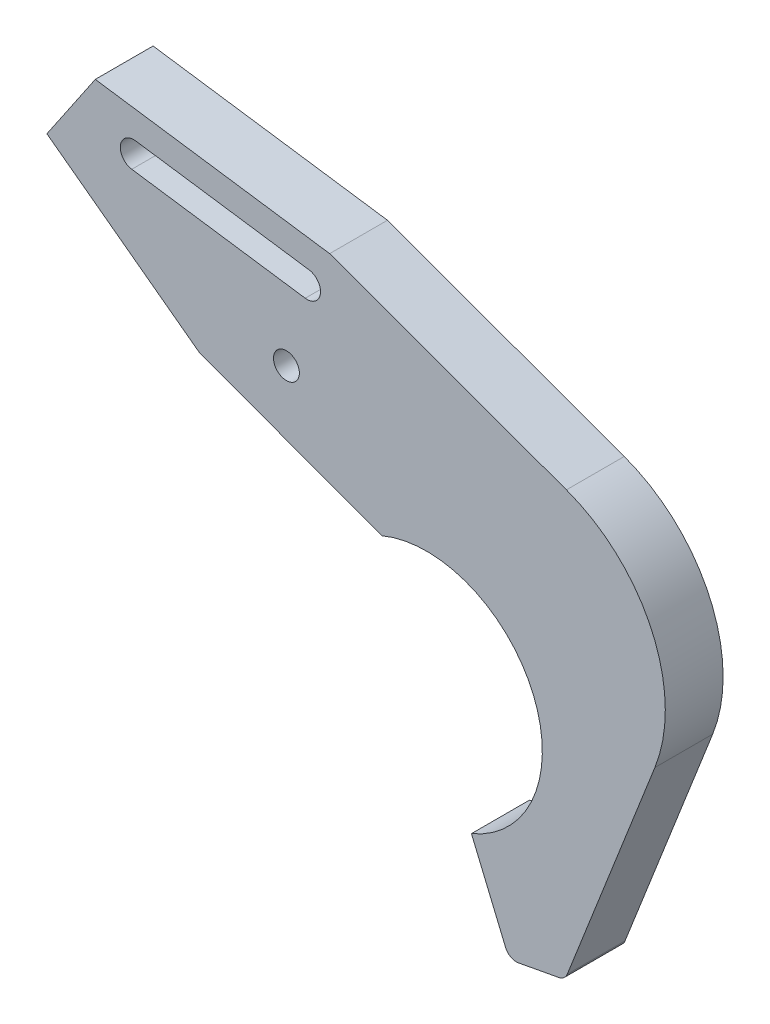
ISO-10303-21;
HEADER;
FILE_DESCRIPTION(('STEP AP214'),'2;1');
FILE_NAME('part.step','',(''),(''),'','','');
FILE_SCHEMA(('AUTOMOTIVE_DESIGN { 1 0 10303 214 1 1 1 1 }'));
ENDSEC;
DATA;
#1=APPLICATION_CONTEXT('core data for automotive mechanical design processes');
#2=APPLICATION_PROTOCOL_DEFINITION('international standard','automotive_design',2000,#1);
#3=PRODUCT_CONTEXT('',#1,'mechanical');
#4=PRODUCT('Part','Part','',(#3));
#5=PRODUCT_RELATED_PRODUCT_CATEGORY('part','',(#4));
#6=PRODUCT_DEFINITION_FORMATION('','',#4);
#7=PRODUCT_DEFINITION_CONTEXT('part definition',#1,'design');
#8=PRODUCT_DEFINITION('design','',#6,#7);
#9=PRODUCT_DEFINITION_SHAPE('','',#8);
#10=(LENGTH_UNIT() NAMED_UNIT(*) SI_UNIT(.MILLI.,.METRE.));
#11=(NAMED_UNIT(*) PLANE_ANGLE_UNIT() SI_UNIT($,.RADIAN.));
#12=(NAMED_UNIT(*) SI_UNIT($,.STERADIAN.) SOLID_ANGLE_UNIT());
#13=UNCERTAINTY_MEASURE_WITH_UNIT(LENGTH_MEASURE(1.E-05),#10,'distance_accuracy_value','');
#14=(GEOMETRIC_REPRESENTATION_CONTEXT(3) GLOBAL_UNCERTAINTY_ASSIGNED_CONTEXT((#13)) GLOBAL_UNIT_ASSIGNED_CONTEXT((#10,
#11,#12)) REPRESENTATION_CONTEXT('',''));
#15=CARTESIAN_POINT('',(0.,0.,0.));
#16=DIRECTION('',(0.,0.,1.));
#17=DIRECTION('',(1.,0.,0.));
#18=AXIS2_PLACEMENT_3D('',#15,#16,#17);
#19=CARTESIAN_POINT('',(51.2000389622178,6.21803864779508,12.7));
#20=DIRECTION('',(0.,0.,1.));
#21=DIRECTION('',(1.,0.,0.));
#22=AXIS2_PLACEMENT_3D('',#19,#20,#21);
#23=PLANE('',#22);
#24=DIRECTION('',(0.386867201283231,-0.92213543938582,0.));
#25=VECTOR('',#24,1.);
#26=CARTESIAN_POINT('',(61.0264658748119,-17.2042015126048,12.7));
#27=LINE('',#26,#25);
#28=CARTESIAN_POINT('',(61.0264658748119,-17.2042015126048,12.7));
#29=VERTEX_POINT('',#28);
#30=CARTESIAN_POINT('',(68.5408768623582,-35.1155278146079,12.7));
#31=VERTEX_POINT('',#30);
#32=EDGE_CURVE('E232',#29,#31,#27,.T.);
#33=ORIENTED_EDGE('',*,*,#32,.T.);
#34=CARTESIAN_POINT('',(70.8831008783982,-34.1328851233485,12.7));
#35=DIRECTION('',(0.,0.,1.));
#36=DIRECTION('',(1.,0.,0.));
#37=AXIS2_PLACEMENT_3D('',#34,#35,#36);
#38=CIRCLE('',#37,2.53999999999999);
#39=CARTESIAN_POINT('',(71.347877302438,-36.6300000337315,12.7));
#40=VERTEX_POINT('',#39);
#41=EDGE_CURVE('E48',#31,#40,#38,.T.);
#42=ORIENTED_EDGE('',*,*,#41,.T.);
#43=DIRECTION('',(0.983116106449977,0.182982844110145,0.));
#44=VECTOR('',#43,1.);
#45=CARTESIAN_POINT('',(81.5667670797044,-34.7280054444612,12.7));
#46=LINE('',#45,#44);
#47=CARTESIAN_POINT('',(80.1828782284302,-34.9855822619674,12.7));
#48=VERTEX_POINT('',#47);
#49=EDGE_CURVE('E235',#40,#48,#46,.T.);
#50=ORIENTED_EDGE('',*,*,#49,.T.);
#51=CARTESIAN_POINT('',(79.7181018043904,-32.4884673515845,12.7));
#52=DIRECTION('',(0.,0.,1.));
#53=DIRECTION('',(1.,0.,0.));
#54=AXIS2_PLACEMENT_3D('',#51,#52,#53);
#55=CIRCLE('',#54,2.53999999999999);
#56=CARTESIAN_POINT('',(82.0819073101514,-33.4179960122154,12.7));
#57=VERTEX_POINT('',#56);
#58=EDGE_CURVE('E55',#48,#57,#55,.T.);
#59=ORIENTED_EDGE('',*,*,#58,.T.);
#60=DIRECTION('',(0.365956165602747,0.930632088882247,0.));
#61=VECTOR('',#60,1.);
#62=CARTESIAN_POINT('',(95.2803043935317,0.145728286221098,12.7));
#63=LINE('',#62,#61);
#64=CARTESIAN_POINT('',(101.324672793619,15.5166489561378,12.7));
#65=VERTEX_POINT('',#64);
#66=EDGE_CURVE('E238',#57,#65,#63,.T.);
#67=ORIENTED_EDGE('',*,*,#66,.T.);
#68=CARTESIAN_POINT('',(70.5952012187268,27.6005215443405,12.7));
#69=DIRECTION('',(0.,0.,1.));
#70=DIRECTION('',(1.,0.,0.));
#71=AXIS2_PLACEMENT_3D('',#68,#69,#70);
#72=CIRCLE('',#71,33.02);
#73=CARTESIAN_POINT('',(81.8915348264187,58.6281422559537,12.7));
#74=VERTEX_POINT('',#73);
#75=EDGE_CURVE('E311',#65,#74,#72,.T.);
#76=ORIENTED_EDGE('',*,*,#75,.T.);
#77=DIRECTION('',(-0.93966143887381,0.342105802776861,0.));
#78=VECTOR('',#77,1.);
#79=CARTESIAN_POINT('',(113.41396547303,47.1516614771304,12.7));
#80=LINE('',#79,#78);
#81=CARTESIAN_POINT('',(29.8798289099471,77.56422462587,12.7));
#82=VERTEX_POINT('',#81);
#83=EDGE_CURVE('E241',#74,#82,#80,.T.);
#84=ORIENTED_EDGE('',*,*,#83,.T.);
#85=DIRECTION('',(-0.989812837536592,0.142374669965415,0.));
#86=VECTOR('',#85,1.);
#87=CARTESIAN_POINT('',(-21.6036385590415,84.9696061400307,12.7));
#88=LINE('',#87,#86);
#89=CARTESIAN_POINT('',(-21.6036385590415,84.9696061400307,12.7));
#90=VERTEX_POINT('',#89);
#91=EDGE_CURVE('E244',#82,#90,#88,.T.);
#92=ORIENTED_EDGE('',*,*,#91,.T.);
#93=DIRECTION('',(-0.561500064424069,-0.827476693116952,0.));
#94=VECTOR('',#93,1.);
#95=CARTESIAN_POINT('',(-32.2312755205968,69.3077702013021,12.7));
#96=LINE('',#95,#94);
#97=CARTESIAN_POINT('',(-32.2312755205968,69.3077702013021,12.7));
#98=VERTEX_POINT('',#97);
#99=EDGE_CURVE('E218',#90,#98,#96,.T.);
#100=ORIENTED_EDGE('',*,*,#99,.T.);
#101=DIRECTION('',(0.802882803656803,-0.596136900042424,0.));
#102=VECTOR('',#101,1.);
#103=CARTESIAN_POINT('',(1.32132678465555,44.3951126683362,12.7));
#104=LINE('',#103,#102);
#105=CARTESIAN_POINT('',(1.32132678465555,44.3951126683362,12.7));
#106=VERTEX_POINT('',#105);
#107=EDGE_CURVE('E222',#98,#106,#104,.T.);
#108=ORIENTED_EDGE('',*,*,#107,.T.);
#109=DIRECTION('',(0.938352777700583,-0.345679135299775,0.));
#110=VECTOR('',#109,1.);
#111=CARTESIAN_POINT('',(41.3736120496238,29.6402788081949,12.7));
#112=LINE('',#111,#110);
#113=CARTESIAN_POINT('',(41.3736120496238,29.6402788081949,12.7));
#114=VERTEX_POINT('',#113);
#115=EDGE_CURVE('E226',#106,#114,#112,.T.);
#116=ORIENTED_EDGE('',*,*,#115,.T.);
#117=CARTESIAN_POINT('',(51.2000389622178,6.21803864779508,12.7));
#118=DIRECTION('',(0.,0.,-1.));
#119=DIRECTION('',(1.,0.,0.));
#120=AXIS2_PLACEMENT_3D('',#117,#118,#119);
#121=CIRCLE('',#120,25.4);
#122=EDGE_CURVE('E229',#114,#29,#121,.T.);
#123=ORIENTED_EDGE('',*,*,#122,.T.);
#124=EDGE_LOOP('',(#33,#42,#50,#59,#67,#76,#84,#92,#100,#108,#116,#123));
#125=FACE_BOUND('',#124,.T.);
#126=CARTESIAN_POINT('',(20.3901427657872,51.5029722152476,12.7));
#127=DIRECTION('',(0.,0.,1.));
#128=DIRECTION('',(1.,0.,0.));
#129=AXIS2_PLACEMENT_3D('',#126,#127,#128);
#130=CIRCLE('',#129,2.83838254770481);
#131=CARTESIAN_POINT('',(23.228525313492,51.5029722152476,12.7));
#132=VERTEX_POINT('',#131);
#133=EDGE_CURVE('E210',#132,#132,#130,.T.);
#134=ORIENTED_EDGE('',*,*,#133,.F.);
#135=EDGE_LOOP('',(#134));
#136=FACE_BOUND('',#135,.T.);
#137=DIRECTION('',(-0.989812837536592,0.142374669965415,0.));
#138=VECTOR('',#137,1.);
#139=CARTESIAN_POINT('',(25.3539797880549,72.2175001182984,12.7));
#140=LINE('',#139,#138);
#141=CARTESIAN_POINT('',(25.3539797880549,72.2175001182984,12.7));
#142=VERTEX_POINT('',#141);
#143=CARTESIAN_POINT('',(-12.7460202119451,77.6978037878109,12.7));
#144=VERTEX_POINT('',#143);
#145=EDGE_CURVE('E168',#142,#144,#140,.T.);
#146=ORIENTED_EDGE('',*,*,#145,.F.);
#147=CARTESIAN_POINT('',(24.9354687635728,69.3079405401544,12.7));
#148=DIRECTION('',(0.,0.,1.));
#149=DIRECTION('',(1.,0.,0.));
#150=AXIS2_PLACEMENT_3D('',#147,#148,#149);
#151=CIRCLE('',#150,2.93950479101209);
#152=CARTESIAN_POINT('',(24.5169577390907,66.3983809620103,12.7));
#153=VERTEX_POINT('',#152);
#154=EDGE_CURVE('E157',#153,#142,#151,.T.);
#155=ORIENTED_EDGE('',*,*,#154,.F.);
#156=DIRECTION('',(0.989812837536592,-0.142374669965415,0.));
#157=VECTOR('',#156,1.);
#158=CARTESIAN_POINT('',(24.5169577390907,66.3983809620103,12.7));
#159=LINE('',#158,#157);
#160=CARTESIAN_POINT('',(-13.5830422609093,71.8786846315227,12.7));
#161=VERTEX_POINT('',#160);
#162=EDGE_CURVE('E186',#161,#153,#159,.T.);
#163=ORIENTED_EDGE('',*,*,#162,.F.);
#164=CARTESIAN_POINT('',(-13.1645312364272,74.7882442096668,12.7));
#165=DIRECTION('',(0.,0.,1.));
#166=DIRECTION('',(1.,0.,0.));
#167=AXIS2_PLACEMENT_3D('',#164,#165,#166);
#168=CIRCLE('',#167,2.93950479101209);
#169=EDGE_CURVE('E182',#144,#161,#168,.T.);
#170=ORIENTED_EDGE('',*,*,#169,.F.);
#171=EDGE_LOOP('',(#146,#155,#163,#170));
#172=FACE_BOUND('',#171,.T.);
#173=ADVANCED_FACE('F39',(#125,#136,#172),#23,.T.);
#174=CARTESIAN_POINT('',(51.2000389622178,6.21803864779508,0.));
#175=DIRECTION('',(0.,0.,1.));
#176=DIRECTION('',(1.,0.,0.));
#177=AXIS2_PLACEMENT_3D('',#174,#175,#176);
#178=PLANE('',#177);
#179=CARTESIAN_POINT('',(20.3901427657872,51.5029722152476,0.));
#180=DIRECTION('',(0.,0.,1.));
#181=DIRECTION('',(1.,0.,0.));
#182=AXIS2_PLACEMENT_3D('',#179,#180,#181);
#183=CIRCLE('',#182,2.83838254770481);
#184=CARTESIAN_POINT('',(23.228525313492,51.5029722152476,0.));
#185=VERTEX_POINT('',#184);
#186=EDGE_CURVE('E177',#185,#185,#183,.T.);
#187=ORIENTED_EDGE('',*,*,#186,.T.);
#188=EDGE_LOOP('',(#187));
#189=FACE_BOUND('',#188,.T.);
#190=DIRECTION('',(0.983116106449977,0.182982844110145,0.));
#191=VECTOR('',#190,1.);
#192=CARTESIAN_POINT('',(81.5667670797044,-34.7280054444612,0.));
#193=LINE('',#192,#191);
#194=CARTESIAN_POINT('',(71.347877302438,-36.6300000337315,0.));
#195=VERTEX_POINT('',#194);
#196=CARTESIAN_POINT('',(80.1828782284302,-34.9855822619674,0.));
#197=VERTEX_POINT('',#196);
#198=EDGE_CURVE('E264',#195,#197,#193,.T.);
#199=ORIENTED_EDGE('',*,*,#198,.F.);
#200=CARTESIAN_POINT('',(70.8831008783982,-34.1328851233485,0.));
#201=DIRECTION('',(0.,0.,1.));
#202=DIRECTION('',(1.,0.,0.));
#203=AXIS2_PLACEMENT_3D('',#200,#201,#202);
#204=CIRCLE('',#203,2.53999999999999);
#205=CARTESIAN_POINT('',(68.5408768623582,-35.1155278146079,0.));
#206=VERTEX_POINT('',#205);
#207=EDGE_CURVE('E324',#195,#206,#204,.F.);
#208=ORIENTED_EDGE('',*,*,#207,.T.);
#209=DIRECTION('',(0.386867201283231,-0.92213543938582,0.));
#210=VECTOR('',#209,1.);
#211=CARTESIAN_POINT('',(61.0264658748119,-17.2042015126048,0.));
#212=LINE('',#211,#210);
#213=CARTESIAN_POINT('',(61.0264658748119,-17.2042015126048,0.));
#214=VERTEX_POINT('',#213);
#215=EDGE_CURVE('E261',#214,#206,#212,.T.);
#216=ORIENTED_EDGE('',*,*,#215,.F.);
#217=CARTESIAN_POINT('',(51.2000389622178,6.21803864779508,0.));
#218=DIRECTION('',(0.,0.,-1.));
#219=DIRECTION('',(1.,0.,0.));
#220=AXIS2_PLACEMENT_3D('',#217,#218,#219);
#221=CIRCLE('',#220,25.4);
#222=CARTESIAN_POINT('',(41.3736120496238,29.6402788081949,0.));
#223=VERTEX_POINT('',#222);
#224=EDGE_CURVE('E258',#223,#214,#221,.T.);
#225=ORIENTED_EDGE('',*,*,#224,.F.);
#226=DIRECTION('',(0.938352777700583,-0.345679135299775,0.));
#227=VECTOR('',#226,1.);
#228=CARTESIAN_POINT('',(41.3736120496238,29.6402788081949,0.));
#229=LINE('',#228,#227);
#230=CARTESIAN_POINT('',(1.32132678465555,44.3951126683362,0.));
#231=VERTEX_POINT('',#230);
#232=EDGE_CURVE('E254',#231,#223,#229,.T.);
#233=ORIENTED_EDGE('',*,*,#232,.F.);
#234=DIRECTION('',(0.802882803656803,-0.596136900042424,0.));
#235=VECTOR('',#234,1.);
#236=CARTESIAN_POINT('',(1.32132678465555,44.3951126683362,0.));
#237=LINE('',#236,#235);
#238=CARTESIAN_POINT('',(-32.2312755205968,69.3077702013021,0.));
#239=VERTEX_POINT('',#238);
#240=EDGE_CURVE('E251',#239,#231,#237,.T.);
#241=ORIENTED_EDGE('',*,*,#240,.F.);
#242=DIRECTION('',(-0.561500064424069,-0.827476693116952,0.));
#243=VECTOR('',#242,1.);
#244=CARTESIAN_POINT('',(-32.2312755205968,69.3077702013021,0.));
#245=LINE('',#244,#243);
#246=CARTESIAN_POINT('',(-21.6036385590415,84.9696061400307,0.));
#247=VERTEX_POINT('',#246);
#248=EDGE_CURVE('E214',#247,#239,#245,.T.);
#249=ORIENTED_EDGE('',*,*,#248,.F.);
#250=DIRECTION('',(-0.989812837536592,0.142374669965415,0.));
#251=VECTOR('',#250,1.);
#252=CARTESIAN_POINT('',(-21.6036385590415,84.9696061400307,0.));
#253=LINE('',#252,#251);
#254=CARTESIAN_POINT('',(29.8798289099471,77.56422462587,0.));
#255=VERTEX_POINT('',#254);
#256=EDGE_CURVE('E223',#255,#247,#253,.T.);
#257=ORIENTED_EDGE('',*,*,#256,.F.);
#258=DIRECTION('',(-0.93966143887381,0.342105802776861,0.));
#259=VECTOR('',#258,1.);
#260=CARTESIAN_POINT('',(113.41396547303,47.1516614771304,0.));
#261=LINE('',#260,#259);
#262=CARTESIAN_POINT('',(81.8915348264187,58.6281422559537,0.));
#263=VERTEX_POINT('',#262);
#264=EDGE_CURVE('E271',#263,#255,#261,.T.);
#265=ORIENTED_EDGE('',*,*,#264,.F.);
#266=CARTESIAN_POINT('',(70.5952012187268,27.6005215443405,0.));
#267=DIRECTION('',(0.,0.,1.));
#268=DIRECTION('',(1.,0.,0.));
#269=AXIS2_PLACEMENT_3D('',#266,#267,#268);
#270=CIRCLE('',#269,33.02);
#271=CARTESIAN_POINT('',(101.324672793619,15.5166489561378,0.));
#272=VERTEX_POINT('',#271);
#273=EDGE_CURVE('E303',#263,#272,#270,.F.);
#274=ORIENTED_EDGE('',*,*,#273,.T.);
#275=DIRECTION('',(0.365956165602748,0.930632088882247,0.));
#276=VECTOR('',#275,1.);
#277=CARTESIAN_POINT('',(109.035804568071,35.1261742092101,0.));
#278=LINE('',#277,#276);
#279=CARTESIAN_POINT('',(82.0819073101513,-33.4179960122154,0.));
#280=VERTEX_POINT('',#279);
#281=EDGE_CURVE('E268',#280,#272,#278,.T.);
#282=ORIENTED_EDGE('',*,*,#281,.F.);
#283=CARTESIAN_POINT('',(79.7181018043904,-32.4884673515845,0.));
#284=DIRECTION('',(0.,0.,1.));
#285=DIRECTION('',(1.,0.,0.));
#286=AXIS2_PLACEMENT_3D('',#283,#284,#285);
#287=CIRCLE('',#286,2.53999999999999);
#288=EDGE_CURVE('E321',#280,#197,#287,.F.);
#289=ORIENTED_EDGE('',*,*,#288,.T.);
#290=EDGE_LOOP('',(#199,#208,#216,#225,#233,#241,#249,#257,#265,#274,#282,#289));
#291=FACE_BOUND('',#290,.T.);
#292=CARTESIAN_POINT('',(24.9354687635728,69.3079405401544,0.));
#293=DIRECTION('',(0.,0.,1.));
#294=DIRECTION('',(1.,0.,0.));
#295=AXIS2_PLACEMENT_3D('',#292,#293,#294);
#296=CIRCLE('',#295,2.93950479101209);
#297=CARTESIAN_POINT('',(24.5169577390907,66.3983809620103,0.));
#298=VERTEX_POINT('',#297);
#299=CARTESIAN_POINT('',(25.3539797880549,72.2175001182984,0.));
#300=VERTEX_POINT('',#299);
#301=EDGE_CURVE('E191',#298,#300,#296,.T.);
#302=ORIENTED_EDGE('',*,*,#301,.T.);
#303=DIRECTION('',(-0.989812837536592,0.142374669965415,0.));
#304=VECTOR('',#303,1.);
#305=CARTESIAN_POINT('',(25.3539797880549,72.2175001182984,0.));
#306=LINE('',#305,#304);
#307=CARTESIAN_POINT('',(-12.7460202119451,77.6978037878109,0.));
#308=VERTEX_POINT('',#307);
#309=EDGE_CURVE('E175',#300,#308,#306,.T.);
#310=ORIENTED_EDGE('',*,*,#309,.T.);
#311=CARTESIAN_POINT('',(-13.1645312364272,74.7882442096668,0.));
#312=DIRECTION('',(0.,0.,1.));
#313=DIRECTION('',(1.,0.,0.));
#314=AXIS2_PLACEMENT_3D('',#311,#312,#313);
#315=CIRCLE('',#314,2.93950479101209);
#316=CARTESIAN_POINT('',(-13.5830422609093,71.8786846315227,0.));
#317=VERTEX_POINT('',#316);
#318=EDGE_CURVE('E196',#308,#317,#315,.T.);
#319=ORIENTED_EDGE('',*,*,#318,.T.);
#320=DIRECTION('',(0.989812837536592,-0.142374669965415,0.));
#321=VECTOR('',#320,1.);
#322=CARTESIAN_POINT('',(24.5169577390907,66.3983809620103,0.));
#323=LINE('',#322,#321);
#324=EDGE_CURVE('E169',#317,#298,#323,.T.);
#325=ORIENTED_EDGE('',*,*,#324,.T.);
#326=EDGE_LOOP('',(#302,#310,#319,#325));
#327=FACE_BOUND('',#326,.T.);
#328=ADVANCED_FACE('F343',(#189,#291,#327),#178,.F.);
#329=CARTESIAN_POINT('',(-32.2312755205968,69.3077702013021,12.7));
#330=DIRECTION('',(0.827476693116952,-0.561500064424069,0.));
#331=DIRECTION('',(0.561500064424069,0.827476693116952,0.));
#332=AXIS2_PLACEMENT_3D('',#329,#330,#331);
#333=PLANE('',#332);
#334=ORIENTED_EDGE('',*,*,#248,.T.);
#335=DIRECTION('',(0.,0.,-1.));
#336=VECTOR('',#335,1.);
#337=CARTESIAN_POINT('',(-32.2312755205968,69.3077702013021,12.7));
#338=LINE('',#337,#336);
#339=EDGE_CURVE('E295',#98,#239,#338,.T.);
#340=ORIENTED_EDGE('',*,*,#339,.F.);
#341=ORIENTED_EDGE('',*,*,#99,.F.);
#342=DIRECTION('',(0.,0.,-1.));
#343=VECTOR('',#342,1.);
#344=CARTESIAN_POINT('',(-21.6036385590415,84.9696061400307,12.7));
#345=LINE('',#344,#343);
#346=EDGE_CURVE('E247',#90,#247,#345,.T.);
#347=ORIENTED_EDGE('',*,*,#346,.T.);
#348=EDGE_LOOP('',(#334,#340,#341,#347));
#349=FACE_BOUND('',#348,.T.);
#350=ADVANCED_FACE('F363',(#349),#333,.F.);
#351=CARTESIAN_POINT('',(1.32132678465555,44.3951126683362,12.7));
#352=DIRECTION('',(0.596136900042424,0.802882803656803,0.));
#353=DIRECTION('',(-0.802882803656803,0.596136900042424,0.));
#354=AXIS2_PLACEMENT_3D('',#351,#352,#353);
#355=PLANE('',#354);
#356=ORIENTED_EDGE('',*,*,#240,.T.);
#357=DIRECTION('',(0.,0.,-1.));
#358=VECTOR('',#357,1.);
#359=CARTESIAN_POINT('',(1.32132678465555,44.3951126683362,12.7));
#360=LINE('',#359,#358);
#361=EDGE_CURVE('E291',#106,#231,#360,.T.);
#362=ORIENTED_EDGE('',*,*,#361,.F.);
#363=ORIENTED_EDGE('',*,*,#107,.F.);
#364=ORIENTED_EDGE('',*,*,#339,.T.);
#365=EDGE_LOOP('',(#356,#362,#363,#364));
#366=FACE_BOUND('',#365,.T.);
#367=ADVANCED_FACE('F357',(#366),#355,.F.);
#368=CARTESIAN_POINT('',(41.3736120496238,29.6402788081949,12.7));
#369=DIRECTION('',(0.345679135299775,0.938352777700583,0.));
#370=DIRECTION('',(-0.938352777700583,0.345679135299775,0.));
#371=AXIS2_PLACEMENT_3D('',#368,#369,#370);
#372=PLANE('',#371);
#373=ORIENTED_EDGE('',*,*,#232,.T.);
#374=DIRECTION('',(0.,0.,-1.));
#375=VECTOR('',#374,1.);
#376=CARTESIAN_POINT('',(41.3736120496238,29.6402788081949,12.7));
#377=LINE('',#376,#375);
#378=EDGE_CURVE('E287',#114,#223,#377,.T.);
#379=ORIENTED_EDGE('',*,*,#378,.F.);
#380=ORIENTED_EDGE('',*,*,#115,.F.);
#381=ORIENTED_EDGE('',*,*,#361,.T.);
#382=EDGE_LOOP('',(#373,#379,#380,#381));
#383=FACE_BOUND('',#382,.T.);
#384=ADVANCED_FACE('F353',(#383),#372,.F.);
#385=CARTESIAN_POINT('',(51.2000389622178,6.21803864779508,12.7));
#386=DIRECTION('',(0.,0.,-1.));
#387=DIRECTION('',(-1.,0.,0.));
#388=AXIS2_PLACEMENT_3D('',#385,#386,#387);
#389=CYLINDRICAL_SURFACE('',#388,25.4);
#390=ORIENTED_EDGE('',*,*,#224,.T.);
#391=DIRECTION('',(0.,0.,-1.));
#392=VECTOR('',#391,1.);
#393=CARTESIAN_POINT('',(61.0264658748119,-17.2042015126048,12.7));
#394=LINE('',#393,#392);
#395=EDGE_CURVE('E283',#29,#214,#394,.T.);
#396=ORIENTED_EDGE('',*,*,#395,.F.);
#397=ORIENTED_EDGE('',*,*,#122,.F.);
#398=ORIENTED_EDGE('',*,*,#378,.T.);
#399=EDGE_LOOP('',(#390,#396,#397,#398));
#400=FACE_BOUND('',#399,.T.);
#401=ADVANCED_FACE('F349',(#400),#389,.F.);
#402=CARTESIAN_POINT('',(61.0264658748119,-17.2042015126048,12.7));
#403=DIRECTION('',(0.92213543938582,0.386867201283231,0.));
#404=DIRECTION('',(-0.386867201283231,0.922135439385821,0.));
#405=AXIS2_PLACEMENT_3D('',#402,#403,#404);
#406=PLANE('',#405);
#407=ORIENTED_EDGE('',*,*,#215,.T.);
#408=DIRECTION('',(0.,0.,-1.));
#409=VECTOR('',#408,1.);
#410=CARTESIAN_POINT('',(68.5408768623582,-35.1155278146079,12.7));
#411=LINE('',#410,#409);
#412=EDGE_CURVE('E63',#206,#31,#411,.F.);
#413=ORIENTED_EDGE('',*,*,#412,.T.);
#414=ORIENTED_EDGE('',*,*,#32,.F.);
#415=ORIENTED_EDGE('',*,*,#395,.T.);
#416=EDGE_LOOP('',(#407,#413,#414,#415));
#417=FACE_BOUND('',#416,.T.);
#418=ADVANCED_FACE('F345',(#417),#406,.F.);
#419=CARTESIAN_POINT('',(81.5667670797044,-34.7280054444612,12.7));
#420=DIRECTION('',(-0.182982844110145,0.983116106449977,0.));
#421=DIRECTION('',(-0.983116106449977,-0.182982844110145,0.));
#422=AXIS2_PLACEMENT_3D('',#419,#420,#421);
#423=PLANE('',#422);
#424=ORIENTED_EDGE('',*,*,#49,.F.);
#425=DIRECTION('',(0.,0.,-1.));
#426=VECTOR('',#425,1.);
#427=CARTESIAN_POINT('',(71.347877302438,-36.6300000337315,12.7));
#428=LINE('',#427,#426);
#429=EDGE_CURVE('E317',#40,#195,#428,.T.);
#430=ORIENTED_EDGE('',*,*,#429,.T.);
#431=ORIENTED_EDGE('',*,*,#198,.T.);
#432=DIRECTION('',(0.,0.,-1.));
#433=VECTOR('',#432,1.);
#434=CARTESIAN_POINT('',(80.1828782284302,-34.9855822619674,12.7));
#435=LINE('',#434,#433);
#436=EDGE_CURVE('E314',#197,#48,#435,.F.);
#437=ORIENTED_EDGE('',*,*,#436,.T.);
#438=EDGE_LOOP('',(#424,#430,#431,#437));
#439=FACE_BOUND('',#438,.T.);
#440=ADVANCED_FACE('F337',(#439),#423,.F.);
#441=CARTESIAN_POINT('',(109.035804568071,35.1261742092101,12.7));
#442=DIRECTION('',(-0.930632088882247,0.365956165602748,0.));
#443=DIRECTION('',(-0.365956165602748,-0.930632088882247,0.));
#444=AXIS2_PLACEMENT_3D('',#441,#442,#443);
#445=PLANE('',#444);
#446=ORIENTED_EDGE('',*,*,#66,.F.);
#447=DIRECTION('',(0.,0.,-1.));
#448=VECTOR('',#447,1.);
#449=CARTESIAN_POINT('',(82.0819073101513,-33.4179960122154,12.7));
#450=LINE('',#449,#448);
#451=EDGE_CURVE('E11',#57,#280,#450,.T.);
#452=ORIENTED_EDGE('',*,*,#451,.T.);
#453=ORIENTED_EDGE('',*,*,#281,.T.);
#454=DIRECTION('',(0.,0.,-1.));
#455=VECTOR('',#454,1.);
#456=CARTESIAN_POINT('',(101.324672793619,15.5166489561378,12.7));
#457=LINE('',#456,#455);
#458=EDGE_CURVE('E307',#272,#65,#457,.F.);
#459=ORIENTED_EDGE('',*,*,#458,.T.);
#460=EDGE_LOOP('',(#446,#452,#453,#459));
#461=FACE_BOUND('',#460,.T.);
#462=ADVANCED_FACE('F380',(#461),#445,.F.);
#463=CARTESIAN_POINT('',(113.41396547303,47.1516614771304,12.7));
#464=DIRECTION('',(-0.342105802776861,-0.93966143887381,0.));
#465=DIRECTION('',(0.939661438873811,-0.342105802776861,0.));
#466=AXIS2_PLACEMENT_3D('',#463,#464,#465);
#467=PLANE('',#466);
#468=ORIENTED_EDGE('',*,*,#83,.F.);
#469=DIRECTION('',(0.,0.,-1.));
#470=VECTOR('',#469,1.);
#471=CARTESIAN_POINT('',(81.8915348264187,58.6281422559537,12.7));
#472=LINE('',#471,#470);
#473=EDGE_CURVE('E299',#74,#263,#472,.T.);
#474=ORIENTED_EDGE('',*,*,#473,.T.);
#475=ORIENTED_EDGE('',*,*,#264,.T.);
#476=DIRECTION('',(0.,0.,-1.));
#477=VECTOR('',#476,1.);
#478=CARTESIAN_POINT('',(29.8798289099471,77.56422462587,12.7));
#479=LINE('',#478,#477);
#480=EDGE_CURVE('E279',#82,#255,#479,.T.);
#481=ORIENTED_EDGE('',*,*,#480,.F.);
#482=EDGE_LOOP('',(#468,#474,#475,#481));
#483=FACE_BOUND('',#482,.T.);
#484=ADVANCED_FACE('F372',(#483),#467,.F.);
#485=CARTESIAN_POINT('',(-21.6036385590415,84.9696061400307,12.7));
#486=DIRECTION('',(-0.142374669965415,-0.989812837536592,0.));
#487=DIRECTION('',(0.989812837536592,-0.142374669965415,0.));
#488=AXIS2_PLACEMENT_3D('',#485,#486,#487);
#489=PLANE('',#488);
#490=ORIENTED_EDGE('',*,*,#256,.T.);
#491=ORIENTED_EDGE('',*,*,#346,.F.);
#492=ORIENTED_EDGE('',*,*,#91,.F.);
#493=ORIENTED_EDGE('',*,*,#480,.T.);
#494=EDGE_LOOP('',(#490,#491,#492,#493));
#495=FACE_BOUND('',#494,.T.);
#496=ADVANCED_FACE('F368',(#495),#489,.F.);
#497=CARTESIAN_POINT('',(20.3901427657872,51.5029722152476,12.7));
#498=DIRECTION('',(0.,0.,-1.));
#499=DIRECTION('',(-1.,0.,0.));
#500=AXIS2_PLACEMENT_3D('',#497,#498,#499);
#501=CYLINDRICAL_SURFACE('',#500,2.83838254770481);
#502=ORIENTED_EDGE('',*,*,#133,.T.);
#503=EDGE_LOOP('',(#502));
#504=FACE_BOUND('',#503,.T.);
#505=ORIENTED_EDGE('',*,*,#186,.F.);
#506=EDGE_LOOP('',(#505));
#507=FACE_BOUND('',#506,.T.);
#508=ADVANCED_FACE('F395',(#504,#507),#501,.F.);
#509=CARTESIAN_POINT('',(24.9354687635728,69.3079405401544,12.7));
#510=DIRECTION('',(0.,0.,-1.));
#511=DIRECTION('',(-1.,0.,0.));
#512=AXIS2_PLACEMENT_3D('',#509,#510,#511);
#513=CYLINDRICAL_SURFACE('',#512,2.93950479101209);
#514=ORIENTED_EDGE('',*,*,#301,.F.);
#515=DIRECTION('',(0.,0.,-1.));
#516=VECTOR('',#515,1.);
#517=CARTESIAN_POINT('',(24.5169577390907,66.3983809620103,12.7));
#518=LINE('',#517,#516);
#519=EDGE_CURVE('E163',#153,#298,#518,.T.);
#520=ORIENTED_EDGE('',*,*,#519,.F.);
#521=ORIENTED_EDGE('',*,*,#154,.T.);
#522=DIRECTION('',(0.,0.,-1.));
#523=VECTOR('',#522,1.);
#524=CARTESIAN_POINT('',(25.3539797880549,72.2175001182984,12.7));
#525=LINE('',#524,#523);
#526=EDGE_CURVE('E160',#142,#300,#525,.T.);
#527=ORIENTED_EDGE('',*,*,#526,.T.);
#528=EDGE_LOOP('',(#514,#520,#521,#527));
#529=FACE_BOUND('',#528,.T.);
#530=ADVANCED_FACE('F159',(#529),#513,.F.);
#531=CARTESIAN_POINT('',(25.3539797880549,72.2175001182984,12.7));
#532=DIRECTION('',(-0.142374669965415,-0.989812837536592,0.));
#533=DIRECTION('',(0.989812837536592,-0.142374669965415,0.));
#534=AXIS2_PLACEMENT_3D('',#531,#532,#533);
#535=PLANE('',#534);
#536=ORIENTED_EDGE('',*,*,#309,.F.);
#537=ORIENTED_EDGE('',*,*,#526,.F.);
#538=ORIENTED_EDGE('',*,*,#145,.T.);
#539=DIRECTION('',(0.,0.,-1.));
#540=VECTOR('',#539,1.);
#541=CARTESIAN_POINT('',(-12.7460202119451,77.6978037878109,12.7));
#542=LINE('',#541,#540);
#543=EDGE_CURVE('E178',#144,#308,#542,.T.);
#544=ORIENTED_EDGE('',*,*,#543,.T.);
#545=EDGE_LOOP('',(#536,#537,#538,#544));
#546=FACE_BOUND('',#545,.T.);
#547=ADVANCED_FACE('F172',(#546),#535,.T.);
#548=CARTESIAN_POINT('',(-13.1645312364272,74.7882442096668,12.7));
#549=DIRECTION('',(0.,0.,-1.));
#550=DIRECTION('',(-1.,0.,0.));
#551=AXIS2_PLACEMENT_3D('',#548,#549,#550);
#552=CYLINDRICAL_SURFACE('',#551,2.93950479101209);
#553=ORIENTED_EDGE('',*,*,#318,.F.);
#554=ORIENTED_EDGE('',*,*,#543,.F.);
#555=ORIENTED_EDGE('',*,*,#169,.T.);
#556=DIRECTION('',(0.,0.,-1.));
#557=VECTOR('',#556,1.);
#558=CARTESIAN_POINT('',(-13.5830422609093,71.8786846315227,12.7));
#559=LINE('',#558,#557);
#560=EDGE_CURVE('E205',#161,#317,#559,.T.);
#561=ORIENTED_EDGE('',*,*,#560,.T.);
#562=EDGE_LOOP('',(#553,#554,#555,#561));
#563=FACE_BOUND('',#562,.T.);
#564=ADVANCED_FACE('F421',(#563),#552,.F.);
#565=CARTESIAN_POINT('',(24.5169577390907,66.3983809620103,12.7));
#566=DIRECTION('',(0.142374669965415,0.989812837536592,0.));
#567=DIRECTION('',(-0.989812837536592,0.142374669965415,0.));
#568=AXIS2_PLACEMENT_3D('',#565,#566,#567);
#569=PLANE('',#568);
#570=ORIENTED_EDGE('',*,*,#324,.F.);
#571=ORIENTED_EDGE('',*,*,#560,.F.);
#572=ORIENTED_EDGE('',*,*,#162,.T.);
#573=ORIENTED_EDGE('',*,*,#519,.T.);
#574=EDGE_LOOP('',(#570,#571,#572,#573));
#575=FACE_BOUND('',#574,.T.);
#576=ADVANCED_FACE('F417',(#575),#569,.T.);
#577=CARTESIAN_POINT('',(70.5952012187268,27.6005215443405,12.7));
#578=DIRECTION('',(0.,0.,-1.));
#579=DIRECTION('',(-1.,0.,0.));
#580=AXIS2_PLACEMENT_3D('',#577,#578,#579);
#581=CYLINDRICAL_SURFACE('',#580,33.02);
#582=ORIENTED_EDGE('',*,*,#75,.F.);
#583=ORIENTED_EDGE('',*,*,#458,.F.);
#584=ORIENTED_EDGE('',*,*,#273,.F.);
#585=ORIENTED_EDGE('',*,*,#473,.F.);
#586=EDGE_LOOP('',(#582,#583,#584,#585));
#587=FACE_BOUND('',#586,.T.);
#588=ADVANCED_FACE('F378',(#587),#581,.T.);
#589=CARTESIAN_POINT('',(70.8831008783982,-34.1328851233485,12.7));
#590=DIRECTION('',(0.,0.,-1.));
#591=DIRECTION('',(-1.,0.,0.));
#592=AXIS2_PLACEMENT_3D('',#589,#590,#591);
#593=CYLINDRICAL_SURFACE('',#592,2.53999999999999);
#594=ORIENTED_EDGE('',*,*,#41,.F.);
#595=ORIENTED_EDGE('',*,*,#412,.F.);
#596=ORIENTED_EDGE('',*,*,#207,.F.);
#597=ORIENTED_EDGE('',*,*,#429,.F.);
#598=EDGE_LOOP('',(#594,#595,#596,#597));
#599=FACE_BOUND('',#598,.T.);
#600=ADVANCED_FACE('F340',(#599),#593,.T.);
#601=CARTESIAN_POINT('',(79.7181018043904,-32.4884673515845,12.7));
#602=DIRECTION('',(0.,0.,-1.));
#603=DIRECTION('',(-1.,0.,0.));
#604=AXIS2_PLACEMENT_3D('',#601,#602,#603);
#605=CYLINDRICAL_SURFACE('',#604,2.53999999999999);
#606=ORIENTED_EDGE('',*,*,#58,.F.);
#607=ORIENTED_EDGE('',*,*,#436,.F.);
#608=ORIENTED_EDGE('',*,*,#288,.F.);
#609=ORIENTED_EDGE('',*,*,#451,.F.);
#610=EDGE_LOOP('',(#606,#607,#608,#609));
#611=FACE_BOUND('',#610,.T.);
#612=ADVANCED_FACE('F41',(#611),#605,.T.);
#613=CLOSED_SHELL('',(#173,#328,#350,#367,#384,#401,#418,#440,#462,#484,#496,#508,#530,#547,
#564,#576,#588,#600,#612));
#614=MANIFOLD_SOLID_BREP('B2',#613);
#615=ADVANCED_BREP_SHAPE_REPRESENTATION('',(#18,#614),#14);
#616=SHAPE_DEFINITION_REPRESENTATION(#9,#615);
ENDSEC;
END-ISO-10303-21;
